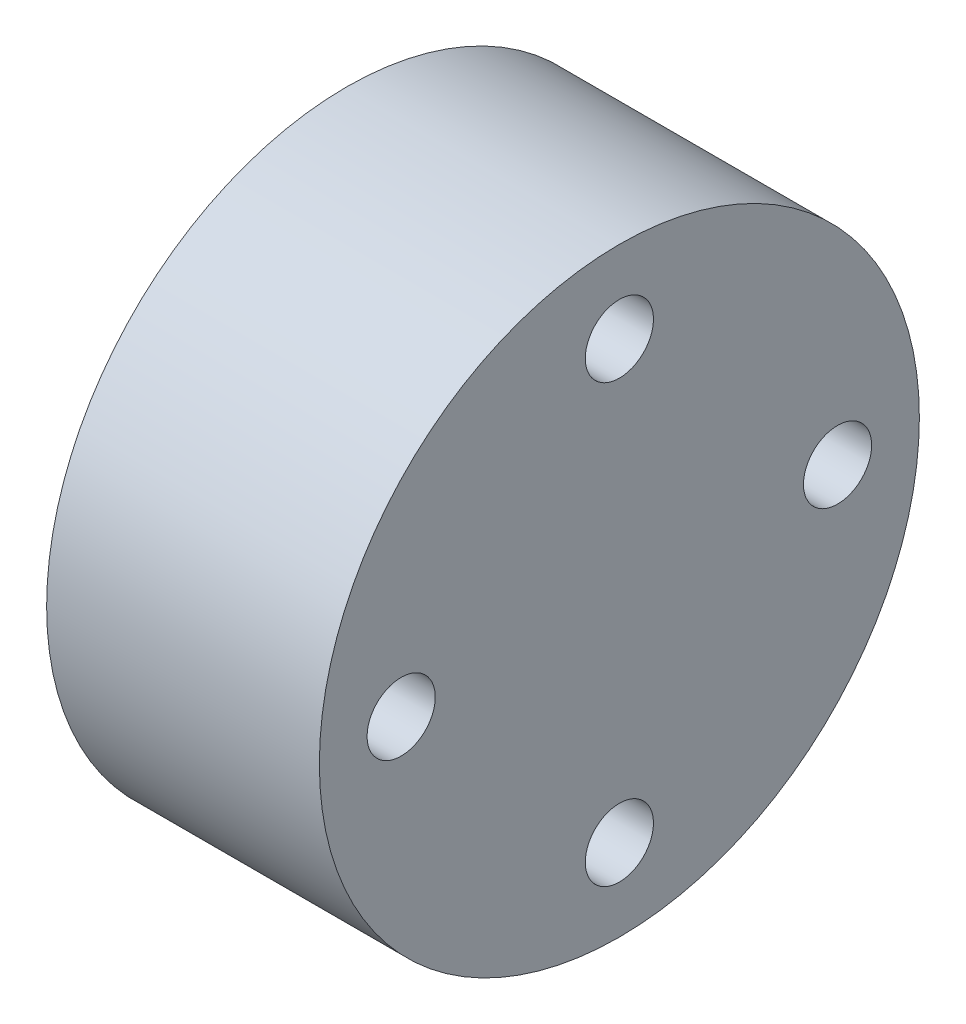
ISO-10303-21;
HEADER;
FILE_DESCRIPTION(('STEP AP214'),'2;1');
FILE_NAME('part.step','',(''),(''),'','','');
FILE_SCHEMA(('AUTOMOTIVE_DESIGN { 1 0 10303 214 1 1 1 1 }'));
ENDSEC;
DATA;
#1=APPLICATION_CONTEXT('core data for automotive mechanical design processes');
#2=APPLICATION_PROTOCOL_DEFINITION('international standard','automotive_design',2000,#1);
#3=PRODUCT_CONTEXT('',#1,'mechanical');
#4=PRODUCT('Part','Part','',(#3));
#5=PRODUCT_RELATED_PRODUCT_CATEGORY('part','',(#4));
#6=PRODUCT_DEFINITION_FORMATION('','',#4);
#7=PRODUCT_DEFINITION_CONTEXT('part definition',#1,'design');
#8=PRODUCT_DEFINITION('design','',#6,#7);
#9=PRODUCT_DEFINITION_SHAPE('','',#8);
#10=(LENGTH_UNIT() NAMED_UNIT(*) SI_UNIT(.MILLI.,.METRE.));
#11=(NAMED_UNIT(*) PLANE_ANGLE_UNIT() SI_UNIT($,.RADIAN.));
#12=(NAMED_UNIT(*) SI_UNIT($,.STERADIAN.) SOLID_ANGLE_UNIT());
#13=UNCERTAINTY_MEASURE_WITH_UNIT(LENGTH_MEASURE(1.E-05),#10,'distance_accuracy_value','');
#14=(GEOMETRIC_REPRESENTATION_CONTEXT(3) GLOBAL_UNCERTAINTY_ASSIGNED_CONTEXT((#13)) GLOBAL_UNIT_ASSIGNED_CONTEXT((#10,
#11,#12)) REPRESENTATION_CONTEXT('',''));
#15=CARTESIAN_POINT('',(0.,0.,0.));
#16=DIRECTION('',(0.,0.,1.));
#17=DIRECTION('',(1.,0.,0.));
#18=AXIS2_PLACEMENT_3D('',#15,#16,#17);
#19=CARTESIAN_POINT('',(10.,0.,0.));
#20=DIRECTION('',(-1.,0.,0.));
#21=DIRECTION('',(0.,0.,1.));
#22=AXIS2_PLACEMENT_3D('',#19,#20,#21);
#23=CYLINDRICAL_SURFACE('',#22,11.);
#24=CARTESIAN_POINT('',(10.,0.,0.));
#25=DIRECTION('',(1.,0.,0.));
#26=DIRECTION('',(0.,0.,-1.));
#27=AXIS2_PLACEMENT_3D('',#24,#25,#26);
#28=CIRCLE('',#27,11.);
#29=CARTESIAN_POINT('',(10.,0.,-11.));
#30=VERTEX_POINT('',#29);
#31=EDGE_CURVE('E10',#30,#30,#28,.T.);
#32=ORIENTED_EDGE('',*,*,#31,.F.);
#33=EDGE_LOOP('',(#32));
#34=FACE_BOUND('',#33,.T.);
#35=CARTESIAN_POINT('',(0.,0.,0.));
#36=DIRECTION('',(1.,0.,0.));
#37=DIRECTION('',(0.,0.,-1.));
#38=AXIS2_PLACEMENT_3D('',#35,#36,#37);
#39=CIRCLE('',#38,11.);
#40=CARTESIAN_POINT('',(0.,0.,-11.));
#41=VERTEX_POINT('',#40);
#42=EDGE_CURVE('E34',#41,#41,#39,.T.);
#43=ORIENTED_EDGE('',*,*,#42,.T.);
#44=EDGE_LOOP('',(#43));
#45=FACE_BOUND('',#44,.T.);
#46=ADVANCED_FACE('F31',(#34,#45),#23,.T.);
#47=CARTESIAN_POINT('',(10.,0.,0.));
#48=DIRECTION('',(1.,0.,0.));
#49=DIRECTION('',(0.,0.,-1.));
#50=AXIS2_PLACEMENT_3D('',#47,#48,#49);
#51=PLANE('',#50);
#52=CARTESIAN_POINT('',(10.,-4.54747350886464E-13,-7.99999999999955));
#53=DIRECTION('',(-1.,0.,0.));
#54=DIRECTION('',(0.,0.,1.));
#55=AXIS2_PLACEMENT_3D('',#52,#53,#54);
#56=CIRCLE('',#55,1.25000000000065);
#57=CARTESIAN_POINT('',(10.,-4.54747350886464E-13,-6.7499999999989));
#58=VERTEX_POINT('',#57);
#59=EDGE_CURVE('E58',#58,#58,#56,.T.);
#60=ORIENTED_EDGE('',*,*,#59,.T.);
#61=EDGE_LOOP('',(#60));
#62=FACE_BOUND('',#61,.T.);
#63=CARTESIAN_POINT('',(10.,-8.,9.07535266894292E-13));
#64=DIRECTION('',(-1.,0.,0.));
#65=DIRECTION('',(0.,0.,1.));
#66=AXIS2_PLACEMENT_3D('',#63,#64,#65);
#67=CIRCLE('',#66,1.25000000000092);
#68=CARTESIAN_POINT('',(10.,-8.,1.25000000000183));
#69=VERTEX_POINT('',#68);
#70=EDGE_CURVE('E52',#69,#69,#67,.T.);
#71=ORIENTED_EDGE('',*,*,#70,.T.);
#72=EDGE_LOOP('',(#71));
#73=FACE_BOUND('',#72,.T.);
#74=CARTESIAN_POINT('',(10.,4.53767633447146E-13,8.00000000000045));
#75=DIRECTION('',(-1.,0.,0.));
#76=DIRECTION('',(0.,0.,1.));
#77=AXIS2_PLACEMENT_3D('',#74,#75,#76);
#78=CIRCLE('',#77,1.25000000000033);
#79=CARTESIAN_POINT('',(10.,4.53767633447146E-13,9.25000000000078));
#80=VERTEX_POINT('',#79);
#81=EDGE_CURVE('E46',#80,#80,#78,.T.);
#82=ORIENTED_EDGE('',*,*,#81,.T.);
#83=EDGE_LOOP('',(#82));
#84=FACE_BOUND('',#83,.T.);
#85=CARTESIAN_POINT('',(10.,8.,0.));
#86=DIRECTION('',(-1.,0.,0.));
#87=DIRECTION('',(0.,0.,1.));
#88=AXIS2_PLACEMENT_3D('',#85,#86,#87);
#89=CIRCLE('',#88,1.25);
#90=CARTESIAN_POINT('',(10.,8.,1.25));
#91=VERTEX_POINT('',#90);
#92=EDGE_CURVE('E41',#91,#91,#89,.T.);
#93=ORIENTED_EDGE('',*,*,#92,.T.);
#94=EDGE_LOOP('',(#93));
#95=FACE_BOUND('',#94,.T.);
#96=ORIENTED_EDGE('',*,*,#31,.T.);
#97=EDGE_LOOP('',(#96));
#98=FACE_BOUND('',#97,.T.);
#99=ADVANCED_FACE('F86',(#62,#73,#84,#95,#98),#51,.T.);
#100=CARTESIAN_POINT('',(0.,0.,0.));
#101=DIRECTION('',(1.,0.,0.));
#102=DIRECTION('',(0.,0.,-1.));
#103=AXIS2_PLACEMENT_3D('',#100,#101,#102);
#104=PLANE('',#103);
#105=CARTESIAN_POINT('',(0.,0.,0.));
#106=DIRECTION('',(-1.,0.,0.));
#107=DIRECTION('',(0.,0.,1.));
#108=AXIS2_PLACEMENT_3D('',#105,#106,#107);
#109=CIRCLE('',#108,5.);
#110=CARTESIAN_POINT('',(0.,0.,5.));
#111=VERTEX_POINT('',#110);
#112=EDGE_CURVE('E67',#111,#111,#109,.T.);
#113=ORIENTED_EDGE('',*,*,#112,.F.);
#114=EDGE_LOOP('',(#113));
#115=FACE_BOUND('',#114,.T.);
#116=CARTESIAN_POINT('',(0.,-4.54747350886464E-13,-7.99999999999955));
#117=DIRECTION('',(-1.,0.,0.));
#118=DIRECTION('',(0.,0.,1.));
#119=AXIS2_PLACEMENT_3D('',#116,#117,#118);
#120=CIRCLE('',#119,1.25000000000065);
#121=CARTESIAN_POINT('',(0.,-4.54747350886464E-13,-6.7499999999989));
#122=VERTEX_POINT('',#121);
#123=EDGE_CURVE('E61',#122,#122,#120,.T.);
#124=ORIENTED_EDGE('',*,*,#123,.F.);
#125=EDGE_LOOP('',(#124));
#126=FACE_BOUND('',#125,.T.);
#127=CARTESIAN_POINT('',(0.,-8.,9.07535266894292E-13));
#128=DIRECTION('',(-1.,0.,0.));
#129=DIRECTION('',(0.,0.,1.));
#130=AXIS2_PLACEMENT_3D('',#127,#128,#129);
#131=CIRCLE('',#130,1.25000000000092);
#132=CARTESIAN_POINT('',(0.,-8.,1.25000000000183));
#133=VERTEX_POINT('',#132);
#134=EDGE_CURVE('E55',#133,#133,#131,.T.);
#135=ORIENTED_EDGE('',*,*,#134,.F.);
#136=EDGE_LOOP('',(#135));
#137=FACE_BOUND('',#136,.T.);
#138=CARTESIAN_POINT('',(0.,4.53767633447146E-13,8.00000000000045));
#139=DIRECTION('',(-1.,0.,0.));
#140=DIRECTION('',(0.,0.,1.));
#141=AXIS2_PLACEMENT_3D('',#138,#139,#140);
#142=CIRCLE('',#141,1.25000000000033);
#143=CARTESIAN_POINT('',(0.,4.53767633447146E-13,9.25000000000078));
#144=VERTEX_POINT('',#143);
#145=EDGE_CURVE('E49',#144,#144,#142,.T.);
#146=ORIENTED_EDGE('',*,*,#145,.F.);
#147=EDGE_LOOP('',(#146));
#148=FACE_BOUND('',#147,.T.);
#149=CARTESIAN_POINT('',(0.,8.,0.));
#150=DIRECTION('',(-1.,0.,0.));
#151=DIRECTION('',(0.,0.,1.));
#152=AXIS2_PLACEMENT_3D('',#149,#150,#151);
#153=CIRCLE('',#152,1.25);
#154=CARTESIAN_POINT('',(0.,8.,1.25));
#155=VERTEX_POINT('',#154);
#156=EDGE_CURVE('E43',#155,#155,#153,.T.);
#157=ORIENTED_EDGE('',*,*,#156,.F.);
#158=EDGE_LOOP('',(#157));
#159=FACE_BOUND('',#158,.T.);
#160=ORIENTED_EDGE('',*,*,#42,.F.);
#161=EDGE_LOOP('',(#160));
#162=FACE_BOUND('',#161,.T.);
#163=ADVANCED_FACE('F82',(#115,#126,#137,#148,#159,#162),#104,.F.);
#164=CARTESIAN_POINT('',(10.,8.,0.));
#165=DIRECTION('',(-1.,0.,0.));
#166=DIRECTION('',(0.,0.,1.));
#167=AXIS2_PLACEMENT_3D('',#164,#165,#166);
#168=CYLINDRICAL_SURFACE('',#167,1.25);
#169=ORIENTED_EDGE('',*,*,#92,.F.);
#170=EDGE_LOOP('',(#169));
#171=FACE_BOUND('',#170,.T.);
#172=ORIENTED_EDGE('',*,*,#156,.T.);
#173=EDGE_LOOP('',(#172));
#174=FACE_BOUND('',#173,.T.);
#175=ADVANCED_FACE('F85',(#171,#174),#168,.F.);
#176=CARTESIAN_POINT('',(10.,4.53767633447146E-13,8.00000000000045));
#177=DIRECTION('',(-1.,0.,0.));
#178=DIRECTION('',(0.,0.,1.));
#179=AXIS2_PLACEMENT_3D('',#176,#177,#178);
#180=CYLINDRICAL_SURFACE('',#179,1.25000000000033);
#181=ORIENTED_EDGE('',*,*,#81,.F.);
#182=EDGE_LOOP('',(#181));
#183=FACE_BOUND('',#182,.T.);
#184=ORIENTED_EDGE('',*,*,#145,.T.);
#185=EDGE_LOOP('',(#184));
#186=FACE_BOUND('',#185,.T.);
#187=ADVANCED_FACE('F110',(#183,#186),#180,.F.);
#188=CARTESIAN_POINT('',(10.,-8.,9.07535266894292E-13));
#189=DIRECTION('',(-1.,0.,0.));
#190=DIRECTION('',(0.,0.,1.));
#191=AXIS2_PLACEMENT_3D('',#188,#189,#190);
#192=CYLINDRICAL_SURFACE('',#191,1.25000000000092);
#193=ORIENTED_EDGE('',*,*,#70,.F.);
#194=EDGE_LOOP('',(#193));
#195=FACE_BOUND('',#194,.T.);
#196=ORIENTED_EDGE('',*,*,#134,.T.);
#197=EDGE_LOOP('',(#196));
#198=FACE_BOUND('',#197,.T.);
#199=ADVANCED_FACE('F114',(#195,#198),#192,.F.);
#200=CARTESIAN_POINT('',(10.,-4.54747350886464E-13,-7.99999999999955));
#201=DIRECTION('',(-1.,0.,0.));
#202=DIRECTION('',(0.,0.,1.));
#203=AXIS2_PLACEMENT_3D('',#200,#201,#202);
#204=CYLINDRICAL_SURFACE('',#203,1.25000000000065);
#205=ORIENTED_EDGE('',*,*,#59,.F.);
#206=EDGE_LOOP('',(#205));
#207=FACE_BOUND('',#206,.T.);
#208=ORIENTED_EDGE('',*,*,#123,.T.);
#209=EDGE_LOOP('',(#208));
#210=FACE_BOUND('',#209,.T.);
#211=ADVANCED_FACE('F78',(#207,#210),#204,.F.);
#212=CARTESIAN_POINT('',(5.,0.,0.));
#213=DIRECTION('',(-1.,0.,0.));
#214=DIRECTION('',(0.,0.,1.));
#215=AXIS2_PLACEMENT_3D('',#212,#213,#214);
#216=CYLINDRICAL_SURFACE('',#215,5.);
#217=CARTESIAN_POINT('',(5.,0.,0.));
#218=DIRECTION('',(-1.,0.,0.));
#219=DIRECTION('',(0.,0.,1.));
#220=AXIS2_PLACEMENT_3D('',#217,#218,#219);
#221=CIRCLE('',#220,5.);
#222=CARTESIAN_POINT('',(5.,0.,5.));
#223=VERTEX_POINT('',#222);
#224=EDGE_CURVE('E64',#223,#223,#221,.T.);
#225=ORIENTED_EDGE('',*,*,#224,.F.);
#226=EDGE_LOOP('',(#225));
#227=FACE_BOUND('',#226,.T.);
#228=ORIENTED_EDGE('',*,*,#112,.T.);
#229=EDGE_LOOP('',(#228));
#230=FACE_BOUND('',#229,.T.);
#231=ADVANCED_FACE('F75',(#227,#230),#216,.F.);
#232=CARTESIAN_POINT('',(5.,0.,0.));
#233=DIRECTION('',(-1.,0.,0.));
#234=DIRECTION('',(0.,0.,1.));
#235=AXIS2_PLACEMENT_3D('',#232,#233,#234);
#236=PLANE('',#235);
#237=ORIENTED_EDGE('',*,*,#224,.T.);
#238=EDGE_LOOP('',(#237));
#239=FACE_BOUND('',#238,.T.);
#240=ADVANCED_FACE('F73',(#239),#236,.T.);
#241=CLOSED_SHELL('',(#46,#99,#163,#175,#187,#199,#211,#231,#240));
#242=MANIFOLD_SOLID_BREP('B2',#241);
#243=ADVANCED_BREP_SHAPE_REPRESENTATION('',(#18,#242),#14);
#244=SHAPE_DEFINITION_REPRESENTATION(#9,#243);
ENDSEC;
END-ISO-10303-21;
